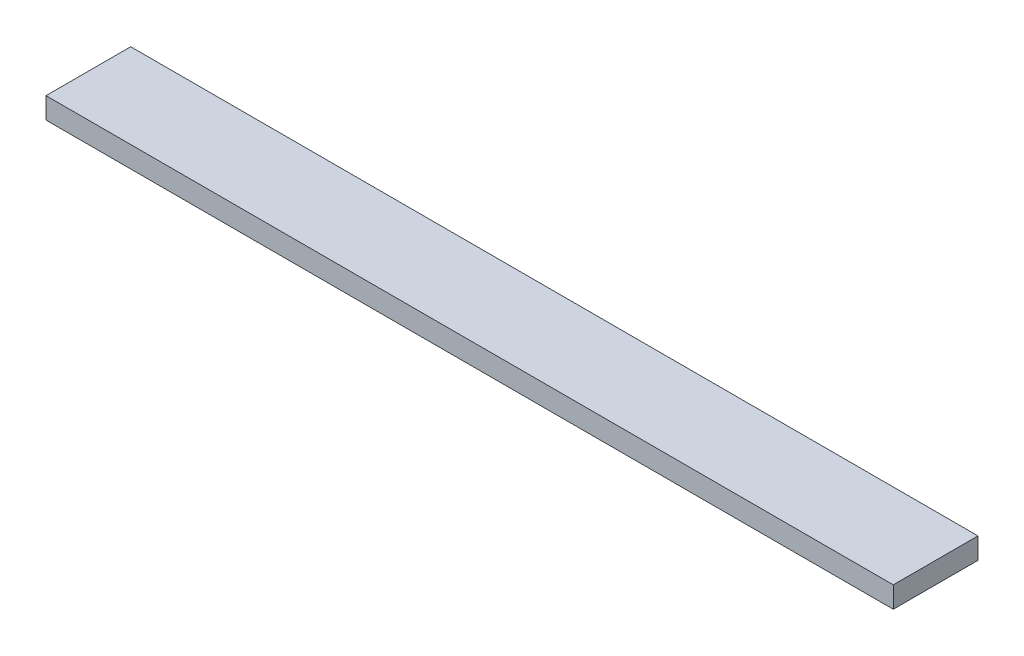
ISO-10303-21;
HEADER;
FILE_DESCRIPTION(('STEP AP214'),'2;1');
FILE_NAME('part.step','',(''),(''),'','','');
FILE_SCHEMA(('AUTOMOTIVE_DESIGN { 1 0 10303 214 1 1 1 1 }'));
ENDSEC;
DATA;
#1=APPLICATION_CONTEXT('core data for automotive mechanical design processes');
#2=APPLICATION_PROTOCOL_DEFINITION('international standard','automotive_design',2000,#1);
#3=PRODUCT_CONTEXT('',#1,'mechanical');
#4=PRODUCT('Part','Part','',(#3));
#5=PRODUCT_RELATED_PRODUCT_CATEGORY('part','',(#4));
#6=PRODUCT_DEFINITION_FORMATION('','',#4);
#7=PRODUCT_DEFINITION_CONTEXT('part definition',#1,'design');
#8=PRODUCT_DEFINITION('design','',#6,#7);
#9=PRODUCT_DEFINITION_SHAPE('','',#8);
#10=(LENGTH_UNIT() NAMED_UNIT(*) SI_UNIT(.MILLI.,.METRE.));
#11=(NAMED_UNIT(*) PLANE_ANGLE_UNIT() SI_UNIT($,.RADIAN.));
#12=(NAMED_UNIT(*) SI_UNIT($,.STERADIAN.) SOLID_ANGLE_UNIT());
#13=UNCERTAINTY_MEASURE_WITH_UNIT(LENGTH_MEASURE(1.E-05),#10,'distance_accuracy_value','');
#14=(GEOMETRIC_REPRESENTATION_CONTEXT(3) GLOBAL_UNCERTAINTY_ASSIGNED_CONTEXT((#13)) GLOBAL_UNIT_ASSIGNED_CONTEXT((#10,
#11,#12)) REPRESENTATION_CONTEXT('',''));
#15=CARTESIAN_POINT('',(0.,0.,0.));
#16=DIRECTION('',(0.,0.,1.));
#17=DIRECTION('',(1.,0.,0.));
#18=AXIS2_PLACEMENT_3D('',#15,#16,#17);
#19=CARTESIAN_POINT('',(-200.000000000003,200.000000000001,40.));
#20=DIRECTION('',(1.,0.,0.));
#21=DIRECTION('',(0.,0.,-1.));
#22=AXIS2_PLACEMENT_3D('',#19,#20,#21);
#23=PLANE('',#22);
#24=DIRECTION('',(0.,-1.,0.));
#25=VECTOR('',#24,1.);
#26=CARTESIAN_POINT('',(-200.000000000003,200.000000000001,0.));
#27=LINE('',#26,#25);
#28=CARTESIAN_POINT('',(-200.000000000003,200.000000000001,0.));
#29=VERTEX_POINT('',#28);
#30=CARTESIAN_POINT('',(-200.000000000003,190.000000000001,0.));
#31=VERTEX_POINT('',#30);
#32=EDGE_CURVE('E99',#29,#31,#27,.T.);
#33=ORIENTED_EDGE('',*,*,#32,.T.);
#34=DIRECTION('',(0.,0.,-1.));
#35=VECTOR('',#34,1.);
#36=CARTESIAN_POINT('',(-200.000000000003,190.000000000001,40.));
#37=LINE('',#36,#35);
#38=CARTESIAN_POINT('',(-200.000000000003,190.000000000001,40.));
#39=VERTEX_POINT('',#38);
#40=EDGE_CURVE('E11',#39,#31,#37,.T.);
#41=ORIENTED_EDGE('',*,*,#40,.F.);
#42=DIRECTION('',(0.,-1.,0.));
#43=VECTOR('',#42,1.);
#44=CARTESIAN_POINT('',(-200.000000000003,200.000000000001,40.));
#45=LINE('',#44,#43);
#46=CARTESIAN_POINT('',(-200.000000000003,200.000000000001,40.));
#47=VERTEX_POINT('',#46);
#48=EDGE_CURVE('E87',#47,#39,#45,.T.);
#49=ORIENTED_EDGE('',*,*,#48,.F.);
#50=DIRECTION('',(0.,0.,-1.));
#51=VECTOR('',#50,1.);
#52=CARTESIAN_POINT('',(-200.000000000003,200.000000000001,40.));
#53=LINE('',#52,#51);
#54=EDGE_CURVE('E95',#47,#29,#53,.T.);
#55=ORIENTED_EDGE('',*,*,#54,.T.);
#56=EDGE_LOOP('',(#33,#41,#49,#55));
#57=FACE_BOUND('',#56,.T.);
#58=ADVANCED_FACE('F36',(#57),#23,.F.);
#59=CARTESIAN_POINT('',(200.000000000003,190.000000000001,40.));
#60=DIRECTION('',(0.,1.,0.));
#61=DIRECTION('',(-1.,0.,0.));
#62=AXIS2_PLACEMENT_3D('',#59,#60,#61);
#63=PLANE('',#62);
#64=DIRECTION('',(1.,0.,0.));
#65=VECTOR('',#64,1.);
#66=CARTESIAN_POINT('',(200.000000000003,190.000000000001,0.));
#67=LINE('',#66,#65);
#68=CARTESIAN_POINT('',(200.000000000003,190.000000000001,0.));
#69=VERTEX_POINT('',#68);
#70=EDGE_CURVE('E91',#31,#69,#67,.T.);
#71=ORIENTED_EDGE('',*,*,#70,.T.);
#72=DIRECTION('',(0.,0.,-1.));
#73=VECTOR('',#72,1.);
#74=CARTESIAN_POINT('',(200.000000000003,190.000000000001,40.));
#75=LINE('',#74,#73);
#76=CARTESIAN_POINT('',(200.000000000003,190.000000000001,40.));
#77=VERTEX_POINT('',#76);
#78=EDGE_CURVE('E44',#77,#69,#75,.T.);
#79=ORIENTED_EDGE('',*,*,#78,.F.);
#80=DIRECTION('',(1.,0.,0.));
#81=VECTOR('',#80,1.);
#82=CARTESIAN_POINT('',(200.000000000003,190.000000000001,40.));
#83=LINE('',#82,#81);
#84=EDGE_CURVE('E82',#39,#77,#83,.T.);
#85=ORIENTED_EDGE('',*,*,#84,.F.);
#86=ORIENTED_EDGE('',*,*,#40,.T.);
#87=EDGE_LOOP('',(#71,#79,#85,#86));
#88=FACE_BOUND('',#87,.T.);
#89=ADVANCED_FACE('F90',(#88),#63,.F.);
#90=CARTESIAN_POINT('',(200.000000000003,200.000000000001,40.));
#91=DIRECTION('',(-1.,0.,0.));
#92=DIRECTION('',(0.,-1.,0.));
#93=AXIS2_PLACEMENT_3D('',#90,#91,#92);
#94=PLANE('',#93);
#95=DIRECTION('',(0.,1.,0.));
#96=VECTOR('',#95,1.);
#97=CARTESIAN_POINT('',(200.000000000003,200.000000000001,0.));
#98=LINE('',#97,#96);
#99=CARTESIAN_POINT('',(200.000000000003,200.000000000001,0.));
#100=VERTEX_POINT('',#99);
#101=EDGE_CURVE('E69',#69,#100,#98,.T.);
#102=ORIENTED_EDGE('',*,*,#101,.T.);
#103=DIRECTION('',(0.,0.,-1.));
#104=VECTOR('',#103,1.);
#105=CARTESIAN_POINT('',(200.000000000003,200.000000000001,40.));
#106=LINE('',#105,#104);
#107=CARTESIAN_POINT('',(200.000000000003,200.000000000001,40.));
#108=VERTEX_POINT('',#107);
#109=EDGE_CURVE('E92',#108,#100,#106,.T.);
#110=ORIENTED_EDGE('',*,*,#109,.F.);
#111=DIRECTION('',(0.,1.,0.));
#112=VECTOR('',#111,1.);
#113=CARTESIAN_POINT('',(200.000000000003,200.000000000001,40.));
#114=LINE('',#113,#112);
#115=EDGE_CURVE('E85',#77,#108,#114,.T.);
#116=ORIENTED_EDGE('',*,*,#115,.F.);
#117=ORIENTED_EDGE('',*,*,#78,.T.);
#118=EDGE_LOOP('',(#102,#110,#116,#117));
#119=FACE_BOUND('',#118,.T.);
#120=ADVANCED_FACE('F93',(#119),#94,.F.);
#121=CARTESIAN_POINT('',(-200.000000000003,200.000000000001,40.));
#122=DIRECTION('',(0.,-1.,0.));
#123=DIRECTION('',(0.,0.,-1.));
#124=AXIS2_PLACEMENT_3D('',#121,#122,#123);
#125=PLANE('',#124);
#126=DIRECTION('',(-1.,0.,0.));
#127=VECTOR('',#126,1.);
#128=CARTESIAN_POINT('',(-200.000000000003,200.000000000001,0.));
#129=LINE('',#128,#127);
#130=EDGE_CURVE('E75',#100,#29,#129,.T.);
#131=ORIENTED_EDGE('',*,*,#130,.T.);
#132=ORIENTED_EDGE('',*,*,#54,.F.);
#133=DIRECTION('',(-1.,0.,0.));
#134=VECTOR('',#133,1.);
#135=CARTESIAN_POINT('',(-200.000000000003,200.000000000001,40.));
#136=LINE('',#135,#134);
#137=EDGE_CURVE('E52',#108,#47,#136,.T.);
#138=ORIENTED_EDGE('',*,*,#137,.F.);
#139=ORIENTED_EDGE('',*,*,#109,.T.);
#140=EDGE_LOOP('',(#131,#132,#138,#139));
#141=FACE_BOUND('',#140,.T.);
#142=ADVANCED_FACE('F106',(#141),#125,.F.);
#143=CARTESIAN_POINT('',(0.,0.,40.));
#144=DIRECTION('',(0.,0.,-1.));
#145=DIRECTION('',(-1.,0.,0.));
#146=AXIS2_PLACEMENT_3D('',#143,#144,#145);
#147=PLANE('',#146);
#148=ORIENTED_EDGE('',*,*,#48,.T.);
#149=ORIENTED_EDGE('',*,*,#84,.T.);
#150=ORIENTED_EDGE('',*,*,#115,.T.);
#151=ORIENTED_EDGE('',*,*,#137,.T.);
#152=EDGE_LOOP('',(#148,#149,#150,#151));
#153=FACE_BOUND('',#152,.T.);
#154=ADVANCED_FACE('F83',(#153),#147,.F.);
#155=CARTESIAN_POINT('',(0.,0.,0.));
#156=DIRECTION('',(0.,0.,-1.));
#157=DIRECTION('',(-1.,0.,0.));
#158=AXIS2_PLACEMENT_3D('',#155,#156,#157);
#159=PLANE('',#158);
#160=ORIENTED_EDGE('',*,*,#32,.F.);
#161=ORIENTED_EDGE('',*,*,#130,.F.);
#162=ORIENTED_EDGE('',*,*,#101,.F.);
#163=ORIENTED_EDGE('',*,*,#70,.F.);
#164=EDGE_LOOP('',(#160,#161,#162,#163));
#165=FACE_BOUND('',#164,.T.);
#166=ADVANCED_FACE('F109',(#165),#159,.T.);
#167=CLOSED_SHELL('',(#58,#89,#120,#142,#154,#166));
#168=MANIFOLD_SOLID_BREP('B2',#167);
#169=ADVANCED_BREP_SHAPE_REPRESENTATION('',(#18,#168),#14);
#170=SHAPE_DEFINITION_REPRESENTATION(#9,#169);
ENDSEC;
END-ISO-10303-21;
